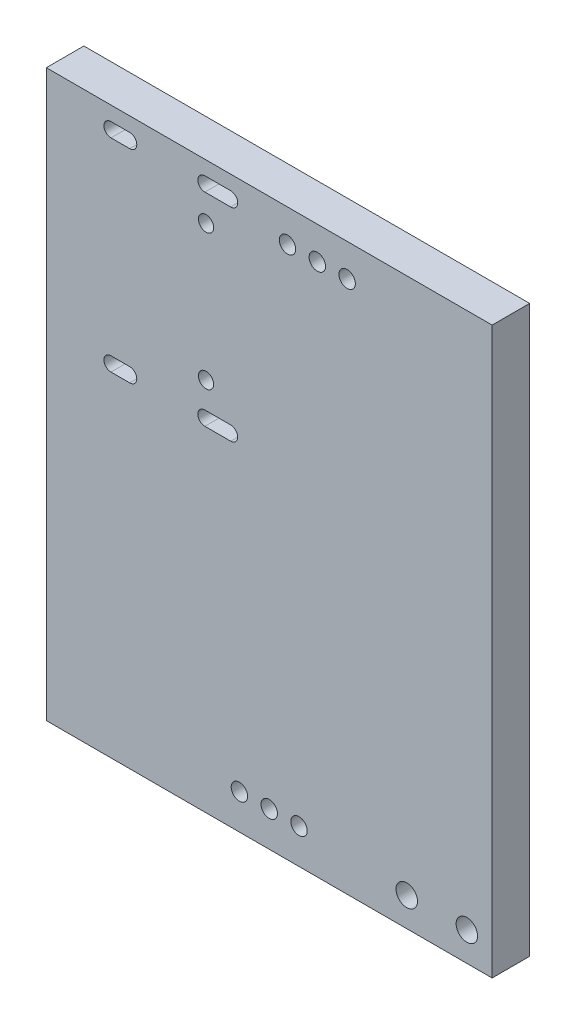
ISO-10303-21;
HEADER;
FILE_DESCRIPTION(('STEP AP214'),'2;1');
FILE_NAME('part.step','',(''),(''),'','','');
FILE_SCHEMA(('AUTOMOTIVE_DESIGN { 1 0 10303 214 1 1 1 1 }'));
ENDSEC;
DATA;
#1=APPLICATION_CONTEXT('core data for automotive mechanical design processes');
#2=APPLICATION_PROTOCOL_DEFINITION('international standard','automotive_design',2000,#1);
#3=PRODUCT_CONTEXT('',#1,'mechanical');
#4=PRODUCT('Part','Part','',(#3));
#5=PRODUCT_RELATED_PRODUCT_CATEGORY('part','',(#4));
#6=PRODUCT_DEFINITION_FORMATION('','',#4);
#7=PRODUCT_DEFINITION_CONTEXT('part definition',#1,'design');
#8=PRODUCT_DEFINITION('design','',#6,#7);
#9=PRODUCT_DEFINITION_SHAPE('','',#8);
#10=(LENGTH_UNIT() NAMED_UNIT(*) SI_UNIT(.MILLI.,.METRE.));
#11=(NAMED_UNIT(*) PLANE_ANGLE_UNIT() SI_UNIT($,.RADIAN.));
#12=(NAMED_UNIT(*) SI_UNIT($,.STERADIAN.) SOLID_ANGLE_UNIT());
#13=UNCERTAINTY_MEASURE_WITH_UNIT(LENGTH_MEASURE(1.E-05),#10,'distance_accuracy_value','');
#14=(GEOMETRIC_REPRESENTATION_CONTEXT(3) GLOBAL_UNCERTAINTY_ASSIGNED_CONTEXT((#13)) GLOBAL_UNIT_ASSIGNED_CONTEXT((#10,
#11,#12)) REPRESENTATION_CONTEXT('',''));
#15=CARTESIAN_POINT('',(0.,0.,0.));
#16=DIRECTION('',(0.,0.,1.));
#17=DIRECTION('',(1.,0.,0.));
#18=AXIS2_PLACEMENT_3D('',#15,#16,#17);
#19=CARTESIAN_POINT('',(-8.790662941326,19.526245872492,0.));
#20=DIRECTION('',(0.,0.,-1.));
#21=DIRECTION('',(-1.,0.,0.));
#22=AXIS2_PLACEMENT_3D('',#19,#20,#21);
#23=CYLINDRICAL_SURFACE('',#22,0.3);
#24=CARTESIAN_POINT('',(-8.790662941326,19.526245872492,1.600050800102));
#25=DIRECTION('',(0.,0.,-1.));
#26=DIRECTION('',(-1.,0.,0.));
#27=AXIS2_PLACEMENT_3D('',#24,#25,#26);
#28=CIRCLE('',#27,0.3);
#29=CARTESIAN_POINT('',(-8.790662941326,19.226245872492,1.600050800102));
#30=VERTEX_POINT('',#29);
#31=CARTESIAN_POINT('',(-8.790662941326,19.826245872492,1.600050800102));
#32=VERTEX_POINT('',#31);
#33=EDGE_CURVE('E144',#30,#32,#28,.T.);
#34=ORIENTED_EDGE('',*,*,#33,.F.);
#35=DIRECTION('',(0.,0.,1.));
#36=VECTOR('',#35,1.);
#37=CARTESIAN_POINT('',(-8.790662941326,19.226245872492,0.));
#38=LINE('',#37,#36);
#39=CARTESIAN_POINT('',(-8.790662941326,19.226245872492,0.));
#40=VERTEX_POINT('',#39);
#41=EDGE_CURVE('E146',#40,#30,#38,.T.);
#42=ORIENTED_EDGE('',*,*,#41,.F.);
#43=CARTESIAN_POINT('',(-8.790662941326,19.526245872492,0.));
#44=DIRECTION('',(0.,0.,-1.));
#45=DIRECTION('',(-1.,0.,0.));
#46=AXIS2_PLACEMENT_3D('',#43,#44,#45);
#47=CIRCLE('',#46,0.3);
#48=CARTESIAN_POINT('',(-8.790662941326,19.826245872492,0.));
#49=VERTEX_POINT('',#48);
#50=EDGE_CURVE('E20',#49,#40,#47,.F.);
#51=ORIENTED_EDGE('',*,*,#50,.F.);
#52=DIRECTION('',(0.,0.,-1.));
#53=VECTOR('',#52,1.);
#54=CARTESIAN_POINT('',(-8.790662941326,19.826245872492,0.));
#55=LINE('',#54,#53);
#56=EDGE_CURVE('E151',#32,#49,#55,.T.);
#57=ORIENTED_EDGE('',*,*,#56,.F.);
#58=EDGE_LOOP('',(#34,#42,#51,#57));
#59=FACE_BOUND('',#58,.T.);
#60=ADVANCED_FACE('F17',(#59),#23,.F.);
#61=CARTESIAN_POINT('',(-8.790662941326,10.886164592329,0.));
#62=DIRECTION('',(0.,0.,-1.));
#63=DIRECTION('',(-1.,0.,0.));
#64=AXIS2_PLACEMENT_3D('',#61,#62,#63);
#65=CYLINDRICAL_SURFACE('',#64,0.3);
#66=CARTESIAN_POINT('',(-8.790662941326,10.886164592329,1.600050800102));
#67=DIRECTION('',(0.,0.,-1.));
#68=DIRECTION('',(-1.,0.,0.));
#69=AXIS2_PLACEMENT_3D('',#66,#67,#68);
#70=CIRCLE('',#69,0.3);
#71=CARTESIAN_POINT('',(-8.790662941326,10.586164592329,1.600050800102));
#72=VERTEX_POINT('',#71);
#73=CARTESIAN_POINT('',(-8.790662941326,11.186164592329,1.600050800102));
#74=VERTEX_POINT('',#73);
#75=EDGE_CURVE('E192',#72,#74,#70,.T.);
#76=ORIENTED_EDGE('',*,*,#75,.F.);
#77=DIRECTION('',(0.,0.,1.));
#78=VECTOR('',#77,1.);
#79=CARTESIAN_POINT('',(-8.790662941326,10.586164592329,0.));
#80=LINE('',#79,#78);
#81=CARTESIAN_POINT('',(-8.790662941326,10.586164592329,0.));
#82=VERTEX_POINT('',#81);
#83=EDGE_CURVE('E185',#82,#72,#80,.T.);
#84=ORIENTED_EDGE('',*,*,#83,.F.);
#85=CARTESIAN_POINT('',(-8.790662941326,10.886164592329,0.));
#86=DIRECTION('',(0.,0.,-1.));
#87=DIRECTION('',(-1.,0.,0.));
#88=AXIS2_PLACEMENT_3D('',#85,#86,#87);
#89=CIRCLE('',#88,0.3);
#90=CARTESIAN_POINT('',(-8.790662941326,11.186164592329,0.));
#91=VERTEX_POINT('',#90);
#92=EDGE_CURVE('E294',#91,#82,#89,.F.);
#93=ORIENTED_EDGE('',*,*,#92,.F.);
#94=DIRECTION('',(0.,0.,-1.));
#95=VECTOR('',#94,1.);
#96=CARTESIAN_POINT('',(-8.790662941326,11.186164592329,0.));
#97=LINE('',#96,#95);
#98=EDGE_CURVE('E188',#74,#91,#97,.T.);
#99=ORIENTED_EDGE('',*,*,#98,.F.);
#100=EDGE_LOOP('',(#76,#84,#93,#99));
#101=FACE_BOUND('',#100,.T.);
#102=ADVANCED_FACE('F708',(#101),#65,.F.);
#103=CARTESIAN_POINT('',(-7.990662941326,19.826245872492,0.));
#104=DIRECTION('',(0.,-1.,0.));
#105=DIRECTION('',(0.,0.,-1.));
#106=AXIS2_PLACEMENT_3D('',#103,#104,#105);
#107=PLANE('',#106);
#108=ORIENTED_EDGE('',*,*,#56,.T.);
#109=DIRECTION('',(-1.,0.,0.));
#110=VECTOR('',#109,1.);
#111=CARTESIAN_POINT('',(-2.049004318009,19.826245872492,0.));
#112=LINE('',#111,#110);
#113=CARTESIAN_POINT('',(-7.990662941326,19.826245872492,0.));
#114=VERTEX_POINT('',#113);
#115=EDGE_CURVE('E143',#114,#49,#112,.T.);
#116=ORIENTED_EDGE('',*,*,#115,.F.);
#117=DIRECTION('',(0.,0.,-1.));
#118=VECTOR('',#117,1.);
#119=CARTESIAN_POINT('',(-7.990662941326,19.826245872492,0.));
#120=LINE('',#119,#118);
#121=CARTESIAN_POINT('',(-7.990662941326,19.826245872492,1.600050800102));
#122=VERTEX_POINT('',#121);
#123=EDGE_CURVE('E283',#114,#122,#120,.F.);
#124=ORIENTED_EDGE('',*,*,#123,.T.);
#125=DIRECTION('',(1.,0.,0.));
#126=VECTOR('',#125,1.);
#127=CARTESIAN_POINT('',(-7.990662941326,19.826245872492,1.600050800102));
#128=LINE('',#127,#126);
#129=EDGE_CURVE('E190',#122,#32,#128,.F.);
#130=ORIENTED_EDGE('',*,*,#129,.T.);
#131=EDGE_LOOP('',(#108,#116,#124,#130));
#132=FACE_BOUND('',#131,.T.);
#133=ADVANCED_FACE('F301',(#132),#107,.T.);
#134=CARTESIAN_POINT('',(-8.790662941326,19.226245872492,0.));
#135=DIRECTION('',(0.,1.,0.));
#136=DIRECTION('',(0.,0.,1.));
#137=AXIS2_PLACEMENT_3D('',#134,#135,#136);
#138=PLANE('',#137);
#139=DIRECTION('',(0.,0.,-1.));
#140=VECTOR('',#139,1.);
#141=CARTESIAN_POINT('',(-7.990662941326,19.226245872492,0.));
#142=LINE('',#141,#140);
#143=CARTESIAN_POINT('',(-7.990662941326,19.226245872492,1.600050800102));
#144=VERTEX_POINT('',#143);
#145=CARTESIAN_POINT('',(-7.990662941326,19.226245872492,0.));
#146=VERTEX_POINT('',#145);
#147=EDGE_CURVE('E156',#144,#146,#142,.T.);
#148=ORIENTED_EDGE('',*,*,#147,.T.);
#149=DIRECTION('',(-1.,0.,0.));
#150=VECTOR('',#149,1.);
#151=CARTESIAN_POINT('',(-2.049004318009,19.226245872492,0.));
#152=LINE('',#151,#150);
#153=EDGE_CURVE('E141',#40,#146,#152,.F.);
#154=ORIENTED_EDGE('',*,*,#153,.F.);
#155=ORIENTED_EDGE('',*,*,#41,.T.);
#156=DIRECTION('',(1.,0.,0.));
#157=VECTOR('',#156,1.);
#158=CARTESIAN_POINT('',(-8.790662941326,19.226245872492,1.600050800102));
#159=LINE('',#158,#157);
#160=EDGE_CURVE('E150',#30,#144,#159,.T.);
#161=ORIENTED_EDGE('',*,*,#160,.T.);
#162=EDGE_LOOP('',(#148,#154,#155,#161));
#163=FACE_BOUND('',#162,.T.);
#164=ADVANCED_FACE('F154',(#163),#138,.T.);
#165=CARTESIAN_POINT('',(-7.990662941326,11.186164592329,0.));
#166=DIRECTION('',(0.,-1.,0.));
#167=DIRECTION('',(0.,0.,-1.));
#168=AXIS2_PLACEMENT_3D('',#165,#166,#167);
#169=PLANE('',#168);
#170=ORIENTED_EDGE('',*,*,#98,.T.);
#171=DIRECTION('',(-1.,0.,0.));
#172=VECTOR('',#171,1.);
#173=CARTESIAN_POINT('',(-2.049004318009,11.186164592329,0.));
#174=LINE('',#173,#172);
#175=CARTESIAN_POINT('',(-7.990662941326,11.186164592329,0.));
#176=VERTEX_POINT('',#175);
#177=EDGE_CURVE('E157',#176,#91,#174,.T.);
#178=ORIENTED_EDGE('',*,*,#177,.F.);
#179=DIRECTION('',(0.,0.,-1.));
#180=VECTOR('',#179,1.);
#181=CARTESIAN_POINT('',(-7.990662941326,11.186164592329,0.));
#182=LINE('',#181,#180);
#183=CARTESIAN_POINT('',(-7.990662941326,11.186164592329,1.600050800102));
#184=VERTEX_POINT('',#183);
#185=EDGE_CURVE('E280',#176,#184,#182,.F.);
#186=ORIENTED_EDGE('',*,*,#185,.T.);
#187=DIRECTION('',(1.,0.,0.));
#188=VECTOR('',#187,1.);
#189=CARTESIAN_POINT('',(-7.990662941326,11.186164592329,1.600050800102));
#190=LINE('',#189,#188);
#191=EDGE_CURVE('E186',#184,#74,#190,.F.);
#192=ORIENTED_EDGE('',*,*,#191,.T.);
#193=EDGE_LOOP('',(#170,#178,#186,#192));
#194=FACE_BOUND('',#193,.T.);
#195=ADVANCED_FACE('F682',(#194),#169,.T.);
#196=CARTESIAN_POINT('',(-8.790662941326,10.586164592329,0.));
#197=DIRECTION('',(0.,1.,0.));
#198=DIRECTION('',(0.,0.,1.));
#199=AXIS2_PLACEMENT_3D('',#196,#197,#198);
#200=PLANE('',#199);
#201=DIRECTION('',(0.,0.,-1.));
#202=VECTOR('',#201,1.);
#203=CARTESIAN_POINT('',(-7.990662941326,10.586164592329,0.));
#204=LINE('',#203,#202);
#205=CARTESIAN_POINT('',(-7.990662941326,10.586164592329,1.600050800102));
#206=VERTEX_POINT('',#205);
#207=CARTESIAN_POINT('',(-7.990662941326,10.586164592329,0.));
#208=VERTEX_POINT('',#207);
#209=EDGE_CURVE('E340',#206,#208,#204,.T.);
#210=ORIENTED_EDGE('',*,*,#209,.T.);
#211=DIRECTION('',(-1.,0.,0.));
#212=VECTOR('',#211,1.);
#213=CARTESIAN_POINT('',(-2.049004318009,10.586164592329,0.));
#214=LINE('',#213,#212);
#215=EDGE_CURVE('E160',#82,#208,#214,.F.);
#216=ORIENTED_EDGE('',*,*,#215,.F.);
#217=ORIENTED_EDGE('',*,*,#83,.T.);
#218=DIRECTION('',(1.,0.,0.));
#219=VECTOR('',#218,1.);
#220=CARTESIAN_POINT('',(-8.790662941326,10.586164592329,1.600050800102));
#221=LINE('',#220,#219);
#222=EDGE_CURVE('E182',#72,#206,#221,.T.);
#223=ORIENTED_EDGE('',*,*,#222,.T.);
#224=EDGE_LOOP('',(#210,#216,#217,#223));
#225=FACE_BOUND('',#224,.T.);
#226=ADVANCED_FACE('F343',(#225),#200,.T.);
#227=CARTESIAN_POINT('',(-4.790815341631,19.526245872492,0.));
#228=DIRECTION('',(0.,0.,-1.));
#229=DIRECTION('',(-1.,0.,0.));
#230=AXIS2_PLACEMENT_3D('',#227,#228,#229);
#231=CYLINDRICAL_SURFACE('',#230,0.3);
#232=CARTESIAN_POINT('',(-4.790815341631,19.526245872492,1.600050800102));
#233=DIRECTION('',(0.,0.,-1.));
#234=DIRECTION('',(-1.,0.,0.));
#235=AXIS2_PLACEMENT_3D('',#232,#233,#234);
#236=CIRCLE('',#235,0.3);
#237=CARTESIAN_POINT('',(-4.790815341631,19.226245872492,1.600050800102));
#238=VERTEX_POINT('',#237);
#239=CARTESIAN_POINT('',(-4.790815341631,19.826245872492,1.600050800102));
#240=VERTEX_POINT('',#239);
#241=EDGE_CURVE('E184',#238,#240,#236,.T.);
#242=ORIENTED_EDGE('',*,*,#241,.F.);
#243=DIRECTION('',(0.,0.,1.));
#244=VECTOR('',#243,1.);
#245=CARTESIAN_POINT('',(-4.790815341631,19.226245872492,0.));
#246=LINE('',#245,#244);
#247=CARTESIAN_POINT('',(-4.790815341631,19.226245872492,0.));
#248=VERTEX_POINT('',#247);
#249=EDGE_CURVE('E178',#248,#238,#246,.T.);
#250=ORIENTED_EDGE('',*,*,#249,.F.);
#251=CARTESIAN_POINT('',(-4.790815341631,19.526245872492,0.));
#252=DIRECTION('',(0.,0.,-1.));
#253=DIRECTION('',(-1.,0.,0.));
#254=AXIS2_PLACEMENT_3D('',#251,#252,#253);
#255=CIRCLE('',#254,0.3);
#256=CARTESIAN_POINT('',(-4.790815341631,19.826245872492,0.));
#257=VERTEX_POINT('',#256);
#258=EDGE_CURVE('E288',#257,#248,#255,.F.);
#259=ORIENTED_EDGE('',*,*,#258,.F.);
#260=DIRECTION('',(0.,0.,-1.));
#261=VECTOR('',#260,1.);
#262=CARTESIAN_POINT('',(-4.790815341631,19.826245872492,0.));
#263=LINE('',#262,#261);
#264=EDGE_CURVE('E181',#240,#257,#263,.T.);
#265=ORIENTED_EDGE('',*,*,#264,.F.);
#266=EDGE_LOOP('',(#242,#250,#259,#265));
#267=FACE_BOUND('',#266,.T.);
#268=ADVANCED_FACE('F665',(#267),#231,.F.);
#269=CARTESIAN_POINT('',(-4.790815341631,10.886164592329,0.));
#270=DIRECTION('',(0.,0.,-1.));
#271=DIRECTION('',(-1.,0.,0.));
#272=AXIS2_PLACEMENT_3D('',#269,#270,#271);
#273=CYLINDRICAL_SURFACE('',#272,0.3);
#274=CARTESIAN_POINT('',(-4.790815341631,10.886164592329,1.600050800102));
#275=DIRECTION('',(0.,0.,-1.));
#276=DIRECTION('',(-1.,0.,0.));
#277=AXIS2_PLACEMENT_3D('',#274,#275,#276);
#278=CIRCLE('',#277,0.3);
#279=CARTESIAN_POINT('',(-4.790815341631,10.586164592329,1.600050800102));
#280=VERTEX_POINT('',#279);
#281=CARTESIAN_POINT('',(-4.790815341631,11.186164592329,1.600050800102));
#282=VERTEX_POINT('',#281);
#283=EDGE_CURVE('E162',#280,#282,#278,.T.);
#284=ORIENTED_EDGE('',*,*,#283,.F.);
#285=DIRECTION('',(0.,0.,1.));
#286=VECTOR('',#285,1.);
#287=CARTESIAN_POINT('',(-4.790815341631,10.586164592329,0.));
#288=LINE('',#287,#286);
#289=CARTESIAN_POINT('',(-4.790815341631,10.586164592329,0.));
#290=VERTEX_POINT('',#289);
#291=EDGE_CURVE('E170',#290,#280,#288,.T.);
#292=ORIENTED_EDGE('',*,*,#291,.F.);
#293=CARTESIAN_POINT('',(-4.790815341631,10.886164592329,0.));
#294=DIRECTION('',(0.,0.,-1.));
#295=DIRECTION('',(-1.,0.,0.));
#296=AXIS2_PLACEMENT_3D('',#293,#294,#295);
#297=CIRCLE('',#296,0.3);
#298=CARTESIAN_POINT('',(-4.790815341631,11.186164592329,0.));
#299=VERTEX_POINT('',#298);
#300=EDGE_CURVE('E285',#299,#290,#297,.F.);
#301=ORIENTED_EDGE('',*,*,#300,.F.);
#302=DIRECTION('',(0.,0.,-1.));
#303=VECTOR('',#302,1.);
#304=CARTESIAN_POINT('',(-4.790815341631,11.186164592329,0.));
#305=LINE('',#304,#303);
#306=EDGE_CURVE('E173',#282,#299,#305,.T.);
#307=ORIENTED_EDGE('',*,*,#306,.F.);
#308=EDGE_LOOP('',(#284,#292,#301,#307));
#309=FACE_BOUND('',#308,.T.);
#310=ADVANCED_FACE('F394',(#309),#273,.F.);
#311=CARTESIAN_POINT('',(-2.049004318009,8.394079248158,0.));
#312=DIRECTION('',(0.,0.,-1.));
#313=DIRECTION('',(-1.,0.,0.));
#314=AXIS2_PLACEMENT_3D('',#311,#312,#313);
#315=PLANE('',#314);
#316=CARTESIAN_POINT('',(6.371145542291,-2.41300482601,0.));
#317=DIRECTION('',(0.,0.,-1.));
#318=DIRECTION('',(-1.,0.,0.));
#319=AXIS2_PLACEMENT_3D('',#316,#317,#318);
#320=CIRCLE('',#319,0.457200914402);
#321=CARTESIAN_POINT('',(5.913944627889,-2.41300482601,0.));
#322=VERTEX_POINT('',#321);
#323=EDGE_CURVE('E240',#322,#322,#320,.F.);
#324=ORIENTED_EDGE('',*,*,#323,.T.);
#325=EDGE_LOOP('',(#324));
#326=FACE_BOUND('',#325,.T.);
#327=CARTESIAN_POINT('',(3.810007620015,-2.41300482601,0.));
#328=DIRECTION('',(0.,0.,-1.));
#329=DIRECTION('',(-1.,0.,0.));
#330=AXIS2_PLACEMENT_3D('',#327,#328,#329);
#331=CIRCLE('',#330,0.457200914402);
#332=CARTESIAN_POINT('',(3.352806705613,-2.41300482601,0.));
#333=VERTEX_POINT('',#332);
#334=EDGE_CURVE('E244',#333,#333,#331,.F.);
#335=ORIENTED_EDGE('',*,*,#334,.T.);
#336=EDGE_LOOP('',(#335));
#337=FACE_BOUND('',#336,.T.);
#338=CARTESIAN_POINT('',(1.270002540005,19.050038100076,0.));
#339=DIRECTION('',(0.,0.,-1.));
#340=DIRECTION('',(-1.,0.,0.));
#341=AXIS2_PLACEMENT_3D('',#338,#339,#340);
#342=CIRCLE('',#341,0.350012700025);
#343=CARTESIAN_POINT('',(0.91998983998,19.050038100076,0.));
#344=VERTEX_POINT('',#343);
#345=EDGE_CURVE('E247',#344,#344,#342,.F.);
#346=ORIENTED_EDGE('',*,*,#345,.T.);
#347=EDGE_LOOP('',(#346));
#348=FACE_BOUND('',#347,.T.);
#349=CARTESIAN_POINT('',(0.,19.050038100076,0.));
#350=DIRECTION('',(0.,0.,-1.));
#351=DIRECTION('',(-1.,0.,0.));
#352=AXIS2_PLACEMENT_3D('',#349,#350,#351);
#353=CIRCLE('',#352,0.350012700025);
#354=CARTESIAN_POINT('',(-0.350012700025,19.050038100076,0.));
#355=VERTEX_POINT('',#354);
#356=EDGE_CURVE('E250',#355,#355,#353,.F.);
#357=ORIENTED_EDGE('',*,*,#356,.T.);
#358=EDGE_LOOP('',(#357));
#359=FACE_BOUND('',#358,.T.);
#360=CARTESIAN_POINT('',(-0.77887477775,-2.159004318009,0.));
#361=DIRECTION('',(0.,0.,-1.));
#362=DIRECTION('',(-1.,0.,0.));
#363=AXIS2_PLACEMENT_3D('',#360,#361,#362);
#364=CIRCLE('',#363,0.350012700025);
#365=CARTESIAN_POINT('',(-1.128887477775,-2.159004318009,0.));
#366=VERTEX_POINT('',#365);
#367=EDGE_CURVE('E253',#366,#366,#364,.F.);
#368=ORIENTED_EDGE('',*,*,#367,.T.);
#369=EDGE_LOOP('',(#368));
#370=FACE_BOUND('',#369,.T.);
#371=CARTESIAN_POINT('',(-1.270002540005,19.050038100076,0.));
#372=DIRECTION('',(0.,0.,-1.));
#373=DIRECTION('',(-1.,0.,0.));
#374=AXIS2_PLACEMENT_3D('',#371,#372,#373);
#375=CIRCLE('',#374,0.350012700025);
#376=CARTESIAN_POINT('',(-1.62001524003,19.050038100076,0.));
#377=VERTEX_POINT('',#376);
#378=EDGE_CURVE('E256',#377,#377,#375,.F.);
#379=ORIENTED_EDGE('',*,*,#378,.T.);
#380=EDGE_LOOP('',(#379));
#381=FACE_BOUND('',#380,.T.);
#382=CARTESIAN_POINT('',(-2.048877317755,-2.159004318009,0.));
#383=DIRECTION('',(0.,0.,-1.));
#384=DIRECTION('',(-1.,0.,0.));
#385=AXIS2_PLACEMENT_3D('',#382,#383,#384);
#386=CIRCLE('',#385,0.350012700025);
#387=CARTESIAN_POINT('',(-2.39889001778,-2.159004318009,0.));
#388=VERTEX_POINT('',#387);
#389=EDGE_CURVE('E259',#388,#388,#386,.F.);
#390=ORIENTED_EDGE('',*,*,#389,.T.);
#391=EDGE_LOOP('',(#390));
#392=FACE_BOUND('',#391,.T.);
#393=CARTESIAN_POINT('',(-3.31887985776,-2.159004318009,0.));
#394=DIRECTION('',(0.,0.,-1.));
#395=DIRECTION('',(-1.,0.,0.));
#396=AXIS2_PLACEMENT_3D('',#393,#394,#395);
#397=CIRCLE('',#396,0.350012700025);
#398=CARTESIAN_POINT('',(-3.668892557785,-2.159004318009,0.));
#399=VERTEX_POINT('',#398);
#400=EDGE_CURVE('E262',#399,#399,#397,.F.);
#401=ORIENTED_EDGE('',*,*,#400,.T.);
#402=EDGE_LOOP('',(#401));
#403=FACE_BOUND('',#402,.T.);
#404=CARTESIAN_POINT('',(-4.740167640335,12.316187452375,0.));
#405=DIRECTION('',(0.,0.,-1.));
#406=DIRECTION('',(-1.,0.,0.));
#407=AXIS2_PLACEMENT_3D('',#404,#405,#406);
#408=CIRCLE('',#407,0.324993649987);
#409=CARTESIAN_POINT('',(-5.065161290322,12.316187452375,0.));
#410=VERTEX_POINT('',#409);
#411=EDGE_CURVE('E265',#410,#410,#408,.F.);
#412=ORIENTED_EDGE('',*,*,#411,.T.);
#413=EDGE_LOOP('',(#412));
#414=FACE_BOUND('',#413,.T.);
#415=CARTESIAN_POINT('',(-4.740167640335,18.096223012446,0.));
#416=DIRECTION('',(0.,0.,-1.));
#417=DIRECTION('',(-1.,0.,0.));
#418=AXIS2_PLACEMENT_3D('',#415,#416,#417);
#419=CIRCLE('',#418,0.324993649987);
#420=CARTESIAN_POINT('',(-5.065161290322,18.096223012446,0.));
#421=VERTEX_POINT('',#420);
#422=EDGE_CURVE('E268',#421,#421,#419,.F.);
#423=ORIENTED_EDGE('',*,*,#422,.T.);
#424=EDGE_LOOP('',(#423));
#425=FACE_BOUND('',#424,.T.);
#426=DIRECTION('',(1.,0.,0.));
#427=VECTOR('',#426,1.);
#428=CARTESIAN_POINT('',(-4.790815341631,10.586164592329,0.));
#429=LINE('',#428,#427);
#430=CARTESIAN_POINT('',(-3.69078994158,10.586164592329,0.));
#431=VERTEX_POINT('',#430);
#432=EDGE_CURVE('E166',#431,#290,#429,.F.);
#433=ORIENTED_EDGE('',*,*,#432,.F.);
#434=CARTESIAN_POINT('',(-3.69078994158,10.886164592329,0.));
#435=DIRECTION('',(0.,0.,-1.));
#436=DIRECTION('',(-1.,0.,0.));
#437=AXIS2_PLACEMENT_3D('',#434,#435,#436);
#438=CIRCLE('',#437,0.3);
#439=CARTESIAN_POINT('',(-3.69078994158,11.186164592329,0.));
#440=VERTEX_POINT('',#439);
#441=EDGE_CURVE('E169',#431,#440,#438,.F.);
#442=ORIENTED_EDGE('',*,*,#441,.T.);
#443=DIRECTION('',(1.,0.,0.));
#444=VECTOR('',#443,1.);
#445=CARTESIAN_POINT('',(-3.69078994158,11.186164592329,0.));
#446=LINE('',#445,#444);
#447=EDGE_CURVE('E171',#299,#440,#446,.T.);
#448=ORIENTED_EDGE('',*,*,#447,.F.);
#449=ORIENTED_EDGE('',*,*,#300,.T.);
#450=EDGE_LOOP('',(#433,#442,#448,#449));
#451=FACE_BOUND('',#450,.T.);
#452=DIRECTION('',(1.,0.,0.));
#453=VECTOR('',#452,1.);
#454=CARTESIAN_POINT('',(-4.790815341631,19.226245872492,0.));
#455=LINE('',#454,#453);
#456=CARTESIAN_POINT('',(-3.69078994158,19.226245872492,0.));
#457=VERTEX_POINT('',#456);
#458=EDGE_CURVE('E174',#457,#248,#455,.F.);
#459=ORIENTED_EDGE('',*,*,#458,.F.);
#460=CARTESIAN_POINT('',(-3.69078994158,19.526245872492,0.));
#461=DIRECTION('',(0.,0.,-1.));
#462=DIRECTION('',(-1.,0.,0.));
#463=AXIS2_PLACEMENT_3D('',#460,#461,#462);
#464=CIRCLE('',#463,0.3);
#465=CARTESIAN_POINT('',(-3.69078994158,19.826245872492,0.));
#466=VERTEX_POINT('',#465);
#467=EDGE_CURVE('E177',#457,#466,#464,.F.);
#468=ORIENTED_EDGE('',*,*,#467,.T.);
#469=DIRECTION('',(1.,0.,0.));
#470=VECTOR('',#469,1.);
#471=CARTESIAN_POINT('',(-3.69078994158,19.826245872492,0.));
#472=LINE('',#471,#470);
#473=EDGE_CURVE('E179',#257,#466,#472,.T.);
#474=ORIENTED_EDGE('',*,*,#473,.F.);
#475=ORIENTED_EDGE('',*,*,#258,.T.);
#476=EDGE_LOOP('',(#459,#468,#474,#475));
#477=FACE_BOUND('',#476,.T.);
#478=ORIENTED_EDGE('',*,*,#215,.T.);
#479=CARTESIAN_POINT('',(-7.990662941326,10.886164592329,0.));
#480=DIRECTION('',(0.,0.,-1.));
#481=DIRECTION('',(-1.,0.,0.));
#482=AXIS2_PLACEMENT_3D('',#479,#480,#481);
#483=CIRCLE('',#482,0.3);
#484=EDGE_CURVE('E277',#208,#176,#483,.F.);
#485=ORIENTED_EDGE('',*,*,#484,.T.);
#486=ORIENTED_EDGE('',*,*,#177,.T.);
#487=ORIENTED_EDGE('',*,*,#92,.T.);
#488=EDGE_LOOP('',(#478,#485,#486,#487));
#489=FACE_BOUND('',#488,.T.);
#490=ORIENTED_EDGE('',*,*,#153,.T.);
#491=CARTESIAN_POINT('',(-7.990662941326,19.526245872492,0.));
#492=DIRECTION('',(0.,0.,-1.));
#493=DIRECTION('',(-1.,0.,0.));
#494=AXIS2_PLACEMENT_3D('',#491,#492,#493);
#495=CIRCLE('',#494,0.3);
#496=EDGE_CURVE('E281',#146,#114,#495,.F.);
#497=ORIENTED_EDGE('',*,*,#496,.T.);
#498=ORIENTED_EDGE('',*,*,#115,.T.);
#499=ORIENTED_EDGE('',*,*,#50,.T.);
#500=EDGE_LOOP('',(#490,#497,#498,#499));
#501=FACE_BOUND('',#500,.T.);
#502=DIRECTION('',(0.,1.,0.));
#503=VECTOR('',#502,1.);
#504=CARTESIAN_POINT('',(-11.54432308864,-3.649286258573,0.));
#505=LINE('',#504,#503);
#506=CARTESIAN_POINT('',(-11.54432308864,20.43744475489,0.));
#507=VERTEX_POINT('',#506);
#508=CARTESIAN_POINT('',(-11.54432308864,-3.649286258573,0.));
#509=VERTEX_POINT('',#508);
#510=EDGE_CURVE('E317',#507,#509,#505,.F.);
#511=ORIENTED_EDGE('',*,*,#510,.F.);
#512=DIRECTION('',(1.,0.,0.));
#513=VECTOR('',#512,1.);
#514=CARTESIAN_POINT('',(-11.54432308864,20.43744475489,0.));
#515=LINE('',#514,#513);
#516=CARTESIAN_POINT('',(7.446314452629,20.43744475489,0.));
#517=VERTEX_POINT('',#516);
#518=EDGE_CURVE('E284',#517,#507,#515,.F.);
#519=ORIENTED_EDGE('',*,*,#518,.F.);
#520=DIRECTION('',(0.,1.,0.));
#521=VECTOR('',#520,1.);
#522=CARTESIAN_POINT('',(7.446314452629,20.43744475489,0.));
#523=LINE('',#522,#521);
#524=CARTESIAN_POINT('',(7.446314452629,-3.649286258573,0.));
#525=VERTEX_POINT('',#524);
#526=EDGE_CURVE('E287',#525,#517,#523,.T.);
#527=ORIENTED_EDGE('',*,*,#526,.F.);
#528=DIRECTION('',(1.,0.,0.));
#529=VECTOR('',#528,1.);
#530=CARTESIAN_POINT('',(7.446314452629,-3.649286258573,0.));
#531=LINE('',#530,#529);
#532=EDGE_CURVE('E323',#509,#525,#531,.T.);
#533=ORIENTED_EDGE('',*,*,#532,.F.);
#534=EDGE_LOOP('',(#511,#519,#527,#533));
#535=FACE_BOUND('',#534,.T.);
#536=ADVANCED_FACE('F137',(#326,#337,#348,#359,#370,#381,#392,#403,#414,#425,#451,#477,#489,
#501,#535),#315,.T.);
#537=CARTESIAN_POINT('',(7.446314452629,20.43744475489,0.));
#538=DIRECTION('',(1.,0.,0.));
#539=DIRECTION('',(0.,1.,0.));
#540=AXIS2_PLACEMENT_3D('',#537,#538,#539);
#541=PLANE('',#540);
#542=DIRECTION('',(0.,0.,-1.));
#543=VECTOR('',#542,1.);
#544=CARTESIAN_POINT('',(7.446314452629,-3.649286258573,0.));
#545=LINE('',#544,#543);
#546=CARTESIAN_POINT('',(7.446314452629,-3.649286258573,1.600050800102));
#547=VERTEX_POINT('',#546);
#548=EDGE_CURVE('E326',#525,#547,#545,.F.);
#549=ORIENTED_EDGE('',*,*,#548,.F.);
#550=ORIENTED_EDGE('',*,*,#526,.T.);
#551=DIRECTION('',(0.,0.,1.));
#552=VECTOR('',#551,1.);
#553=CARTESIAN_POINT('',(7.446314452629,20.43744475489,0.));
#554=LINE('',#553,#552);
#555=CARTESIAN_POINT('',(7.446314452629,20.43744475489,1.600050800102));
#556=VERTEX_POINT('',#555);
#557=EDGE_CURVE('E311',#556,#517,#554,.F.);
#558=ORIENTED_EDGE('',*,*,#557,.F.);
#559=DIRECTION('',(0.,1.,0.));
#560=VECTOR('',#559,1.);
#561=CARTESIAN_POINT('',(7.446314452629,8.394079248158,1.600050800102));
#562=LINE('',#561,#560);
#563=EDGE_CURVE('E243',#556,#547,#562,.F.);
#564=ORIENTED_EDGE('',*,*,#563,.T.);
#565=EDGE_LOOP('',(#549,#550,#558,#564));
#566=FACE_BOUND('',#565,.T.);
#567=ADVANCED_FACE('F637',(#566),#541,.T.);
#568=CARTESIAN_POINT('',(7.446314452629,-3.649286258573,0.));
#569=DIRECTION('',(0.,-1.,0.));
#570=DIRECTION('',(0.,0.,-1.));
#571=AXIS2_PLACEMENT_3D('',#568,#569,#570);
#572=PLANE('',#571);
#573=DIRECTION('',(0.,0.,1.));
#574=VECTOR('',#573,1.);
#575=CARTESIAN_POINT('',(-11.54432308864,-3.649286258573,0.));
#576=LINE('',#575,#574);
#577=CARTESIAN_POINT('',(-11.54432308864,-3.649286258573,1.600050800102));
#578=VERTEX_POINT('',#577);
#579=EDGE_CURVE('E320',#509,#578,#576,.T.);
#580=ORIENTED_EDGE('',*,*,#579,.F.);
#581=ORIENTED_EDGE('',*,*,#532,.T.);
#582=ORIENTED_EDGE('',*,*,#548,.T.);
#583=DIRECTION('',(-1.,0.,0.));
#584=VECTOR('',#583,1.);
#585=CARTESIAN_POINT('',(-2.049004318009,-3.649286258573,1.600050800102));
#586=LINE('',#585,#584);
#587=EDGE_CURVE('E363',#547,#578,#586,.T.);
#588=ORIENTED_EDGE('',*,*,#587,.T.);
#589=EDGE_LOOP('',(#580,#581,#582,#588));
#590=FACE_BOUND('',#589,.T.);
#591=ADVANCED_FACE('F627',(#590),#572,.T.);
#592=CARTESIAN_POINT('',(-11.54432308864,-3.649286258573,0.));
#593=DIRECTION('',(-1.,0.,0.));
#594=DIRECTION('',(0.,0.,1.));
#595=AXIS2_PLACEMENT_3D('',#592,#593,#594);
#596=PLANE('',#595);
#597=DIRECTION('',(0.,0.,1.));
#598=VECTOR('',#597,1.);
#599=CARTESIAN_POINT('',(-11.54432308864,20.43744475489,0.));
#600=LINE('',#599,#598);
#601=CARTESIAN_POINT('',(-11.54432308864,20.43744475489,1.600050800102));
#602=VERTEX_POINT('',#601);
#603=EDGE_CURVE('E314',#507,#602,#600,.T.);
#604=ORIENTED_EDGE('',*,*,#603,.F.);
#605=ORIENTED_EDGE('',*,*,#510,.T.);
#606=ORIENTED_EDGE('',*,*,#579,.T.);
#607=DIRECTION('',(0.,1.,0.));
#608=VECTOR('',#607,1.);
#609=CARTESIAN_POINT('',(-11.54432308864,8.394079248158,1.600050800102));
#610=LINE('',#609,#608);
#611=EDGE_CURVE('E366',#578,#602,#610,.T.);
#612=ORIENTED_EDGE('',*,*,#611,.T.);
#613=EDGE_LOOP('',(#604,#605,#606,#612));
#614=FACE_BOUND('',#613,.T.);
#615=ADVANCED_FACE('F617',(#614),#596,.T.);
#616=CARTESIAN_POINT('',(-11.54432308864,20.43744475489,0.));
#617=DIRECTION('',(0.,1.,0.));
#618=DIRECTION('',(0.,0.,1.));
#619=AXIS2_PLACEMENT_3D('',#616,#617,#618);
#620=PLANE('',#619);
#621=ORIENTED_EDGE('',*,*,#557,.T.);
#622=ORIENTED_EDGE('',*,*,#518,.T.);
#623=ORIENTED_EDGE('',*,*,#603,.T.);
#624=DIRECTION('',(-1.,0.,0.));
#625=VECTOR('',#624,1.);
#626=CARTESIAN_POINT('',(-2.049004318009,20.43744475489,1.600050800102));
#627=LINE('',#626,#625);
#628=EDGE_CURVE('E239',#602,#556,#627,.F.);
#629=ORIENTED_EDGE('',*,*,#628,.T.);
#630=EDGE_LOOP('',(#621,#622,#623,#629));
#631=FACE_BOUND('',#630,.T.);
#632=ADVANCED_FACE('F608',(#631),#620,.T.);
#633=CARTESIAN_POINT('',(-7.990662941326,19.526245872492,0.));
#634=DIRECTION('',(0.,0.,-1.));
#635=DIRECTION('',(-1.,0.,0.));
#636=AXIS2_PLACEMENT_3D('',#633,#634,#635);
#637=CYLINDRICAL_SURFACE('',#636,0.3);
#638=CARTESIAN_POINT('',(-7.990662941326,19.526245872492,1.600050800102));
#639=DIRECTION('',(0.,0.,-1.));
#640=DIRECTION('',(-1.,0.,0.));
#641=AXIS2_PLACEMENT_3D('',#638,#639,#640);
#642=CIRCLE('',#641,0.3);
#643=EDGE_CURVE('E236',#144,#122,#642,.F.);
#644=ORIENTED_EDGE('',*,*,#643,.T.);
#645=ORIENTED_EDGE('',*,*,#123,.F.);
#646=ORIENTED_EDGE('',*,*,#496,.F.);
#647=ORIENTED_EDGE('',*,*,#147,.F.);
#648=EDGE_LOOP('',(#644,#645,#646,#647));
#649=FACE_BOUND('',#648,.T.);
#650=ADVANCED_FACE('F305',(#649),#637,.F.);
#651=CARTESIAN_POINT('',(-7.990662941326,10.886164592329,0.));
#652=DIRECTION('',(0.,0.,-1.));
#653=DIRECTION('',(-1.,0.,0.));
#654=AXIS2_PLACEMENT_3D('',#651,#652,#653);
#655=CYLINDRICAL_SURFACE('',#654,0.3);
#656=CARTESIAN_POINT('',(-7.990662941326,10.886164592329,1.600050800102));
#657=DIRECTION('',(0.,0.,-1.));
#658=DIRECTION('',(-1.,0.,0.));
#659=AXIS2_PLACEMENT_3D('',#656,#657,#658);
#660=CIRCLE('',#659,0.3);
#661=EDGE_CURVE('E232',#206,#184,#660,.F.);
#662=ORIENTED_EDGE('',*,*,#661,.T.);
#663=ORIENTED_EDGE('',*,*,#185,.F.);
#664=ORIENTED_EDGE('',*,*,#484,.F.);
#665=ORIENTED_EDGE('',*,*,#209,.F.);
#666=EDGE_LOOP('',(#662,#663,#664,#665));
#667=FACE_BOUND('',#666,.T.);
#668=ADVANCED_FACE('F339',(#667),#655,.F.);
#669=CARTESIAN_POINT('',(-3.69078994158,19.826245872492,0.));
#670=DIRECTION('',(0.,-1.,0.));
#671=DIRECTION('',(0.,0.,-1.));
#672=AXIS2_PLACEMENT_3D('',#669,#670,#671);
#673=PLANE('',#672);
#674=ORIENTED_EDGE('',*,*,#264,.T.);
#675=ORIENTED_EDGE('',*,*,#473,.T.);
#676=DIRECTION('',(0.,0.,-1.));
#677=VECTOR('',#676,1.);
#678=CARTESIAN_POINT('',(-3.69078994158,19.826245872492,0.));
#679=LINE('',#678,#677);
#680=CARTESIAN_POINT('',(-3.69078994158,19.826245872492,1.600050800102));
#681=VERTEX_POINT('',#680);
#682=EDGE_CURVE('E276',#466,#681,#679,.F.);
#683=ORIENTED_EDGE('',*,*,#682,.T.);
#684=DIRECTION('',(-1.,0.,0.));
#685=VECTOR('',#684,1.);
#686=CARTESIAN_POINT('',(-2.049004318009,19.826245872492,1.600050800102));
#687=LINE('',#686,#685);
#688=EDGE_CURVE('E235',#681,#240,#687,.T.);
#689=ORIENTED_EDGE('',*,*,#688,.T.);
#690=EDGE_LOOP('',(#674,#675,#683,#689));
#691=FACE_BOUND('',#690,.T.);
#692=ADVANCED_FACE('F581',(#691),#673,.T.);
#693=CARTESIAN_POINT('',(-4.790815341631,19.226245872492,0.));
#694=DIRECTION('',(0.,1.,0.));
#695=DIRECTION('',(0.,0.,1.));
#696=AXIS2_PLACEMENT_3D('',#693,#694,#695);
#697=PLANE('',#696);
#698=DIRECTION('',(0.,0.,-1.));
#699=VECTOR('',#698,1.);
#700=CARTESIAN_POINT('',(-3.69078994158,19.226245872492,0.));
#701=LINE('',#700,#699);
#702=CARTESIAN_POINT('',(-3.69078994158,19.226245872492,1.600050800102));
#703=VERTEX_POINT('',#702);
#704=EDGE_CURVE('E350',#703,#457,#701,.T.);
#705=ORIENTED_EDGE('',*,*,#704,.T.);
#706=ORIENTED_EDGE('',*,*,#458,.T.);
#707=ORIENTED_EDGE('',*,*,#249,.T.);
#708=DIRECTION('',(-1.,0.,0.));
#709=VECTOR('',#708,1.);
#710=CARTESIAN_POINT('',(-2.049004318009,19.226245872492,1.600050800102));
#711=LINE('',#710,#709);
#712=EDGE_CURVE('E231',#238,#703,#711,.F.);
#713=ORIENTED_EDGE('',*,*,#712,.T.);
#714=EDGE_LOOP('',(#705,#706,#707,#713));
#715=FACE_BOUND('',#714,.T.);
#716=ADVANCED_FACE('F405',(#715),#697,.T.);
#717=CARTESIAN_POINT('',(-3.69078994158,19.526245872492,0.));
#718=DIRECTION('',(0.,0.,-1.));
#719=DIRECTION('',(-1.,0.,0.));
#720=AXIS2_PLACEMENT_3D('',#717,#718,#719);
#721=CYLINDRICAL_SURFACE('',#720,0.3);
#722=CARTESIAN_POINT('',(-3.69078994158,19.526245872492,1.600050800102));
#723=DIRECTION('',(0.,0.,-1.));
#724=DIRECTION('',(-1.,0.,0.));
#725=AXIS2_PLACEMENT_3D('',#722,#723,#724);
#726=CIRCLE('',#725,0.3);
#727=EDGE_CURVE('E227',#703,#681,#726,.F.);
#728=ORIENTED_EDGE('',*,*,#727,.T.);
#729=ORIENTED_EDGE('',*,*,#682,.F.);
#730=ORIENTED_EDGE('',*,*,#467,.F.);
#731=ORIENTED_EDGE('',*,*,#704,.F.);
#732=EDGE_LOOP('',(#728,#729,#730,#731));
#733=FACE_BOUND('',#732,.T.);
#734=ADVANCED_FACE('F397',(#733),#721,.F.);
#735=CARTESIAN_POINT('',(-3.69078994158,11.186164592329,0.));
#736=DIRECTION('',(0.,-1.,0.));
#737=DIRECTION('',(0.,0.,-1.));
#738=AXIS2_PLACEMENT_3D('',#735,#736,#737);
#739=PLANE('',#738);
#740=ORIENTED_EDGE('',*,*,#306,.T.);
#741=ORIENTED_EDGE('',*,*,#447,.T.);
#742=DIRECTION('',(0.,0.,-1.));
#743=VECTOR('',#742,1.);
#744=CARTESIAN_POINT('',(-3.69078994158,11.186164592329,0.));
#745=LINE('',#744,#743);
#746=CARTESIAN_POINT('',(-3.69078994158,11.186164592329,1.600050800102));
#747=VERTEX_POINT('',#746);
#748=EDGE_CURVE('E273',#440,#747,#745,.F.);
#749=ORIENTED_EDGE('',*,*,#748,.T.);
#750=DIRECTION('',(-1.,0.,0.));
#751=VECTOR('',#750,1.);
#752=CARTESIAN_POINT('',(-2.049004318009,11.186164592329,1.600050800102));
#753=LINE('',#752,#751);
#754=EDGE_CURVE('E230',#747,#282,#753,.T.);
#755=ORIENTED_EDGE('',*,*,#754,.T.);
#756=EDGE_LOOP('',(#740,#741,#749,#755));
#757=FACE_BOUND('',#756,.T.);
#758=ADVANCED_FACE('F395',(#757),#739,.T.);
#759=CARTESIAN_POINT('',(-4.790815341631,10.586164592329,0.));
#760=DIRECTION('',(0.,1.,0.));
#761=DIRECTION('',(0.,0.,1.));
#762=AXIS2_PLACEMENT_3D('',#759,#760,#761);
#763=PLANE('',#762);
#764=DIRECTION('',(0.,0.,-1.));
#765=VECTOR('',#764,1.);
#766=CARTESIAN_POINT('',(-3.69078994158,10.586164592329,0.));
#767=LINE('',#766,#765);
#768=CARTESIAN_POINT('',(-3.69078994158,10.586164592329,1.600050800102));
#769=VERTEX_POINT('',#768);
#770=EDGE_CURVE('E35',#769,#431,#767,.T.);
#771=ORIENTED_EDGE('',*,*,#770,.T.);
#772=ORIENTED_EDGE('',*,*,#432,.T.);
#773=ORIENTED_EDGE('',*,*,#291,.T.);
#774=DIRECTION('',(-1.,0.,0.));
#775=VECTOR('',#774,1.);
#776=CARTESIAN_POINT('',(-2.049004318009,10.586164592329,1.600050800102));
#777=LINE('',#776,#775);
#778=EDGE_CURVE('E226',#280,#769,#777,.F.);
#779=ORIENTED_EDGE('',*,*,#778,.T.);
#780=EDGE_LOOP('',(#771,#772,#773,#779));
#781=FACE_BOUND('',#780,.T.);
#782=ADVANCED_FACE('F380',(#781),#763,.T.);
#783=CARTESIAN_POINT('',(-3.69078994158,10.886164592329,0.));
#784=DIRECTION('',(0.,0.,-1.));
#785=DIRECTION('',(-1.,0.,0.));
#786=AXIS2_PLACEMENT_3D('',#783,#784,#785);
#787=CYLINDRICAL_SURFACE('',#786,0.3);
#788=CARTESIAN_POINT('',(-3.69078994158,10.886164592329,1.600050800102));
#789=DIRECTION('',(0.,0.,-1.));
#790=DIRECTION('',(-1.,0.,0.));
#791=AXIS2_PLACEMENT_3D('',#788,#789,#790);
#792=CIRCLE('',#791,0.3);
#793=EDGE_CURVE('E224',#769,#747,#792,.F.);
#794=ORIENTED_EDGE('',*,*,#793,.T.);
#795=ORIENTED_EDGE('',*,*,#748,.F.);
#796=ORIENTED_EDGE('',*,*,#441,.F.);
#797=ORIENTED_EDGE('',*,*,#770,.F.);
#798=EDGE_LOOP('',(#794,#795,#796,#797));
#799=FACE_BOUND('',#798,.T.);
#800=ADVANCED_FACE('F386',(#799),#787,.F.);
#801=CARTESIAN_POINT('',(-4.740167640335,18.096223012446,0.));
#802=DIRECTION('',(0.,0.,-1.));
#803=DIRECTION('',(-1.,0.,0.));
#804=AXIS2_PLACEMENT_3D('',#801,#802,#803);
#805=CYLINDRICAL_SURFACE('',#804,0.324993649987);
#806=CARTESIAN_POINT('',(-4.740167640335,18.096223012446,1.600050800102));
#807=DIRECTION('',(0.,0.,-1.));
#808=DIRECTION('',(-1.,0.,0.));
#809=AXIS2_PLACEMENT_3D('',#806,#807,#808);
#810=CIRCLE('',#809,0.324993649987);
#811=CARTESIAN_POINT('',(-5.065161290322,18.096223012446,1.600050800102));
#812=VERTEX_POINT('',#811);
#813=EDGE_CURVE('E221',#812,#812,#810,.F.);
#814=ORIENTED_EDGE('',*,*,#813,.T.);
#815=EDGE_LOOP('',(#814));
#816=FACE_BOUND('',#815,.T.);
#817=ORIENTED_EDGE('',*,*,#422,.F.);
#818=EDGE_LOOP('',(#817));
#819=FACE_BOUND('',#818,.T.);
#820=ADVANCED_FACE('F451',(#816,#819),#805,.F.);
#821=CARTESIAN_POINT('',(-4.740167640335,12.316187452375,0.));
#822=DIRECTION('',(0.,0.,-1.));
#823=DIRECTION('',(-1.,0.,0.));
#824=AXIS2_PLACEMENT_3D('',#821,#822,#823);
#825=CYLINDRICAL_SURFACE('',#824,0.324993649987);
#826=CARTESIAN_POINT('',(-4.740167640335,12.316187452375,1.600050800102));
#827=DIRECTION('',(0.,0.,-1.));
#828=DIRECTION('',(-1.,0.,0.));
#829=AXIS2_PLACEMENT_3D('',#826,#827,#828);
#830=CIRCLE('',#829,0.324993649987);
#831=CARTESIAN_POINT('',(-5.065161290322,12.316187452375,1.600050800102));
#832=VERTEX_POINT('',#831);
#833=EDGE_CURVE('E218',#832,#832,#830,.F.);
#834=ORIENTED_EDGE('',*,*,#833,.T.);
#835=EDGE_LOOP('',(#834));
#836=FACE_BOUND('',#835,.T.);
#837=ORIENTED_EDGE('',*,*,#411,.F.);
#838=EDGE_LOOP('',(#837));
#839=FACE_BOUND('',#838,.T.);
#840=ADVANCED_FACE('F447',(#836,#839),#825,.F.);
#841=CARTESIAN_POINT('',(-3.31887985776,-2.159004318009,0.));
#842=DIRECTION('',(0.,0.,-1.));
#843=DIRECTION('',(-1.,0.,0.));
#844=AXIS2_PLACEMENT_3D('',#841,#842,#843);
#845=CYLINDRICAL_SURFACE('',#844,0.350012700025);
#846=CARTESIAN_POINT('',(-3.31887985776,-2.159004318009,1.600050800102));
#847=DIRECTION('',(0.,0.,-1.));
#848=DIRECTION('',(-1.,0.,0.));
#849=AXIS2_PLACEMENT_3D('',#846,#847,#848);
#850=CIRCLE('',#849,0.350012700025);
#851=CARTESIAN_POINT('',(-3.668892557785,-2.159004318009,1.600050800102));
#852=VERTEX_POINT('',#851);
#853=EDGE_CURVE('E215',#852,#852,#850,.F.);
#854=ORIENTED_EDGE('',*,*,#853,.T.);
#855=EDGE_LOOP('',(#854));
#856=FACE_BOUND('',#855,.T.);
#857=ORIENTED_EDGE('',*,*,#400,.F.);
#858=EDGE_LOOP('',(#857));
#859=FACE_BOUND('',#858,.T.);
#860=ADVANCED_FACE('F443',(#856,#859),#845,.F.);
#861=CARTESIAN_POINT('',(-2.048877317755,-2.159004318009,0.));
#862=DIRECTION('',(0.,0.,-1.));
#863=DIRECTION('',(-1.,0.,0.));
#864=AXIS2_PLACEMENT_3D('',#861,#862,#863);
#865=CYLINDRICAL_SURFACE('',#864,0.350012700025);
#866=CARTESIAN_POINT('',(-2.048877317755,-2.159004318009,1.600050800102));
#867=DIRECTION('',(0.,0.,-1.));
#868=DIRECTION('',(-1.,0.,0.));
#869=AXIS2_PLACEMENT_3D('',#866,#867,#868);
#870=CIRCLE('',#869,0.350012700025);
#871=CARTESIAN_POINT('',(-2.39889001778,-2.159004318009,1.600050800102));
#872=VERTEX_POINT('',#871);
#873=EDGE_CURVE('E212',#872,#872,#870,.F.);
#874=ORIENTED_EDGE('',*,*,#873,.T.);
#875=EDGE_LOOP('',(#874));
#876=FACE_BOUND('',#875,.T.);
#877=ORIENTED_EDGE('',*,*,#389,.F.);
#878=EDGE_LOOP('',(#877));
#879=FACE_BOUND('',#878,.T.);
#880=ADVANCED_FACE('F439',(#876,#879),#865,.F.);
#881=CARTESIAN_POINT('',(-1.270002540005,19.050038100076,0.));
#882=DIRECTION('',(0.,0.,-1.));
#883=DIRECTION('',(-1.,0.,0.));
#884=AXIS2_PLACEMENT_3D('',#881,#882,#883);
#885=CYLINDRICAL_SURFACE('',#884,0.350012700025);
#886=CARTESIAN_POINT('',(-1.270002540005,19.050038100076,1.600050800102));
#887=DIRECTION('',(0.,0.,-1.));
#888=DIRECTION('',(-1.,0.,0.));
#889=AXIS2_PLACEMENT_3D('',#886,#887,#888);
#890=CIRCLE('',#889,0.350012700025);
#891=CARTESIAN_POINT('',(-1.62001524003,19.050038100076,1.600050800102));
#892=VERTEX_POINT('',#891);
#893=EDGE_CURVE('E209',#892,#892,#890,.F.);
#894=ORIENTED_EDGE('',*,*,#893,.T.);
#895=EDGE_LOOP('',(#894));
#896=FACE_BOUND('',#895,.T.);
#897=ORIENTED_EDGE('',*,*,#378,.F.);
#898=EDGE_LOOP('',(#897));
#899=FACE_BOUND('',#898,.T.);
#900=ADVANCED_FACE('F435',(#896,#899),#885,.F.);
#901=CARTESIAN_POINT('',(-0.77887477775,-2.159004318009,0.));
#902=DIRECTION('',(0.,0.,-1.));
#903=DIRECTION('',(-1.,0.,0.));
#904=AXIS2_PLACEMENT_3D('',#901,#902,#903);
#905=CYLINDRICAL_SURFACE('',#904,0.350012700025);
#906=CARTESIAN_POINT('',(-0.77887477775,-2.159004318009,1.600050800102));
#907=DIRECTION('',(0.,0.,-1.));
#908=DIRECTION('',(-1.,0.,0.));
#909=AXIS2_PLACEMENT_3D('',#906,#907,#908);
#910=CIRCLE('',#909,0.350012700025);
#911=CARTESIAN_POINT('',(-1.128887477775,-2.159004318009,1.600050800102));
#912=VERTEX_POINT('',#911);
#913=EDGE_CURVE('E206',#912,#912,#910,.F.);
#914=ORIENTED_EDGE('',*,*,#913,.T.);
#915=EDGE_LOOP('',(#914));
#916=FACE_BOUND('',#915,.T.);
#917=ORIENTED_EDGE('',*,*,#367,.F.);
#918=EDGE_LOOP('',(#917));
#919=FACE_BOUND('',#918,.T.);
#920=ADVANCED_FACE('F431',(#916,#919),#905,.F.);
#921=CARTESIAN_POINT('',(0.,19.050038100076,0.));
#922=DIRECTION('',(0.,0.,-1.));
#923=DIRECTION('',(-1.,0.,0.));
#924=AXIS2_PLACEMENT_3D('',#921,#922,#923);
#925=CYLINDRICAL_SURFACE('',#924,0.350012700025);
#926=CARTESIAN_POINT('',(0.,19.050038100076,1.600050800102));
#927=DIRECTION('',(0.,0.,-1.));
#928=DIRECTION('',(-1.,0.,0.));
#929=AXIS2_PLACEMENT_3D('',#926,#927,#928);
#930=CIRCLE('',#929,0.350012700025);
#931=CARTESIAN_POINT('',(-0.350012700025,19.050038100076,1.600050800102));
#932=VERTEX_POINT('',#931);
#933=EDGE_CURVE('E203',#932,#932,#930,.F.);
#934=ORIENTED_EDGE('',*,*,#933,.T.);
#935=EDGE_LOOP('',(#934));
#936=FACE_BOUND('',#935,.T.);
#937=ORIENTED_EDGE('',*,*,#356,.F.);
#938=EDGE_LOOP('',(#937));
#939=FACE_BOUND('',#938,.T.);
#940=ADVANCED_FACE('F427',(#936,#939),#925,.F.);
#941=CARTESIAN_POINT('',(1.270002540005,19.050038100076,0.));
#942=DIRECTION('',(0.,0.,-1.));
#943=DIRECTION('',(-1.,0.,0.));
#944=AXIS2_PLACEMENT_3D('',#941,#942,#943);
#945=CYLINDRICAL_SURFACE('',#944,0.350012700025);
#946=CARTESIAN_POINT('',(1.270002540005,19.050038100076,1.600050800102));
#947=DIRECTION('',(0.,0.,-1.));
#948=DIRECTION('',(-1.,0.,0.));
#949=AXIS2_PLACEMENT_3D('',#946,#947,#948);
#950=CIRCLE('',#949,0.350012700025);
#951=CARTESIAN_POINT('',(0.91998983998,19.050038100076,1.600050800102));
#952=VERTEX_POINT('',#951);
#953=EDGE_CURVE('E200',#952,#952,#950,.F.);
#954=ORIENTED_EDGE('',*,*,#953,.T.);
#955=EDGE_LOOP('',(#954));
#956=FACE_BOUND('',#955,.T.);
#957=ORIENTED_EDGE('',*,*,#345,.F.);
#958=EDGE_LOOP('',(#957));
#959=FACE_BOUND('',#958,.T.);
#960=ADVANCED_FACE('F423',(#956,#959),#945,.F.);
#961=CARTESIAN_POINT('',(3.810007620015,-2.41300482601,0.));
#962=DIRECTION('',(0.,0.,-1.));
#963=DIRECTION('',(-1.,0.,0.));
#964=AXIS2_PLACEMENT_3D('',#961,#962,#963);
#965=CYLINDRICAL_SURFACE('',#964,0.457200914402);
#966=CARTESIAN_POINT('',(3.810007620015,-2.41300482601,1.600050800102));
#967=DIRECTION('',(0.,0.,-1.));
#968=DIRECTION('',(-1.,0.,0.));
#969=AXIS2_PLACEMENT_3D('',#966,#967,#968);
#970=CIRCLE('',#969,0.457200914402);
#971=CARTESIAN_POINT('',(3.352806705613,-2.41300482601,1.600050800102));
#972=VERTEX_POINT('',#971);
#973=EDGE_CURVE('E26',#972,#972,#970,.F.);
#974=ORIENTED_EDGE('',*,*,#973,.T.);
#975=EDGE_LOOP('',(#974));
#976=FACE_BOUND('',#975,.T.);
#977=ORIENTED_EDGE('',*,*,#334,.F.);
#978=EDGE_LOOP('',(#977));
#979=FACE_BOUND('',#978,.T.);
#980=ADVANCED_FACE('F415',(#976,#979),#965,.F.);
#981=CARTESIAN_POINT('',(6.371145542291,-2.41300482601,0.));
#982=DIRECTION('',(0.,0.,-1.));
#983=DIRECTION('',(-1.,0.,0.));
#984=AXIS2_PLACEMENT_3D('',#981,#982,#983);
#985=CYLINDRICAL_SURFACE('',#984,0.457200914402);
#986=CARTESIAN_POINT('',(6.371145542291,-2.41300482601,1.600050800102));
#987=DIRECTION('',(0.,0.,-1.));
#988=DIRECTION('',(-1.,0.,0.));
#989=AXIS2_PLACEMENT_3D('',#986,#987,#988);
#990=CIRCLE('',#989,0.457200914402);
#991=CARTESIAN_POINT('',(5.913944627889,-2.41300482601,1.600050800102));
#992=VERTEX_POINT('',#991);
#993=EDGE_CURVE('E11',#992,#992,#990,.F.);
#994=ORIENTED_EDGE('',*,*,#993,.T.);
#995=EDGE_LOOP('',(#994));
#996=FACE_BOUND('',#995,.T.);
#997=ORIENTED_EDGE('',*,*,#323,.F.);
#998=EDGE_LOOP('',(#997));
#999=FACE_BOUND('',#998,.T.);
#1000=ADVANCED_FACE('F409',(#996,#999),#985,.F.);
#1001=CARTESIAN_POINT('',(-2.049004318009,8.394079248158,1.600050800102));
#1002=DIRECTION('',(0.,0.,-1.));
#1003=DIRECTION('',(-1.,0.,0.));
#1004=AXIS2_PLACEMENT_3D('',#1001,#1002,#1003);
#1005=PLANE('',#1004);
#1006=ORIENTED_EDGE('',*,*,#993,.F.);
#1007=EDGE_LOOP('',(#1006));
#1008=FACE_BOUND('',#1007,.T.);
#1009=ORIENTED_EDGE('',*,*,#973,.F.);
#1010=EDGE_LOOP('',(#1009));
#1011=FACE_BOUND('',#1010,.T.);
#1012=ORIENTED_EDGE('',*,*,#953,.F.);
#1013=EDGE_LOOP('',(#1012));
#1014=FACE_BOUND('',#1013,.T.);
#1015=ORIENTED_EDGE('',*,*,#933,.F.);
#1016=EDGE_LOOP('',(#1015));
#1017=FACE_BOUND('',#1016,.T.);
#1018=ORIENTED_EDGE('',*,*,#913,.F.);
#1019=EDGE_LOOP('',(#1018));
#1020=FACE_BOUND('',#1019,.T.);
#1021=ORIENTED_EDGE('',*,*,#893,.F.);
#1022=EDGE_LOOP('',(#1021));
#1023=FACE_BOUND('',#1022,.T.);
#1024=ORIENTED_EDGE('',*,*,#873,.F.);
#1025=EDGE_LOOP('',(#1024));
#1026=FACE_BOUND('',#1025,.T.);
#1027=ORIENTED_EDGE('',*,*,#853,.F.);
#1028=EDGE_LOOP('',(#1027));
#1029=FACE_BOUND('',#1028,.T.);
#1030=ORIENTED_EDGE('',*,*,#833,.F.);
#1031=EDGE_LOOP('',(#1030));
#1032=FACE_BOUND('',#1031,.T.);
#1033=ORIENTED_EDGE('',*,*,#813,.F.);
#1034=EDGE_LOOP('',(#1033));
#1035=FACE_BOUND('',#1034,.T.);
#1036=ORIENTED_EDGE('',*,*,#778,.F.);
#1037=ORIENTED_EDGE('',*,*,#283,.T.);
#1038=ORIENTED_EDGE('',*,*,#754,.F.);
#1039=ORIENTED_EDGE('',*,*,#793,.F.);
#1040=EDGE_LOOP('',(#1036,#1037,#1038,#1039));
#1041=FACE_BOUND('',#1040,.T.);
#1042=ORIENTED_EDGE('',*,*,#712,.F.);
#1043=ORIENTED_EDGE('',*,*,#241,.T.);
#1044=ORIENTED_EDGE('',*,*,#688,.F.);
#1045=ORIENTED_EDGE('',*,*,#727,.F.);
#1046=EDGE_LOOP('',(#1042,#1043,#1044,#1045));
#1047=FACE_BOUND('',#1046,.T.);
#1048=ORIENTED_EDGE('',*,*,#222,.F.);
#1049=ORIENTED_EDGE('',*,*,#75,.T.);
#1050=ORIENTED_EDGE('',*,*,#191,.F.);
#1051=ORIENTED_EDGE('',*,*,#661,.F.);
#1052=EDGE_LOOP('',(#1048,#1049,#1050,#1051));
#1053=FACE_BOUND('',#1052,.T.);
#1054=ORIENTED_EDGE('',*,*,#160,.F.);
#1055=ORIENTED_EDGE('',*,*,#33,.T.);
#1056=ORIENTED_EDGE('',*,*,#129,.F.);
#1057=ORIENTED_EDGE('',*,*,#643,.F.);
#1058=EDGE_LOOP('',(#1054,#1055,#1056,#1057));
#1059=FACE_BOUND('',#1058,.T.);
#1060=ORIENTED_EDGE('',*,*,#611,.F.);
#1061=ORIENTED_EDGE('',*,*,#587,.F.);
#1062=ORIENTED_EDGE('',*,*,#563,.F.);
#1063=ORIENTED_EDGE('',*,*,#628,.F.);
#1064=EDGE_LOOP('',(#1060,#1061,#1062,#1063));
#1065=FACE_BOUND('',#1064,.T.);
#1066=ADVANCED_FACE('F296',(#1008,#1011,#1014,#1017,#1020,#1023,#1026,#1029,#1032,#1035,#1041,
#1047,#1053,#1059,#1065),#1005,.F.);
#1067=CLOSED_SHELL('',(#60,#102,#133,#164,#195,#226,#268,#310,#536,#567,#591,#615,#632,#650,
#668,#692,#716,#734,#758,#782,#800,#820,#840,#860,#880,#900,#920,#940,#960,#980,#1000,#1066));
#1068=MANIFOLD_SOLID_BREP('B1',#1067);
#1069=ADVANCED_BREP_SHAPE_REPRESENTATION('',(#18,#1068),#14);
#1070=SHAPE_DEFINITION_REPRESENTATION(#9,#1069);
ENDSEC;
END-ISO-10303-21;
